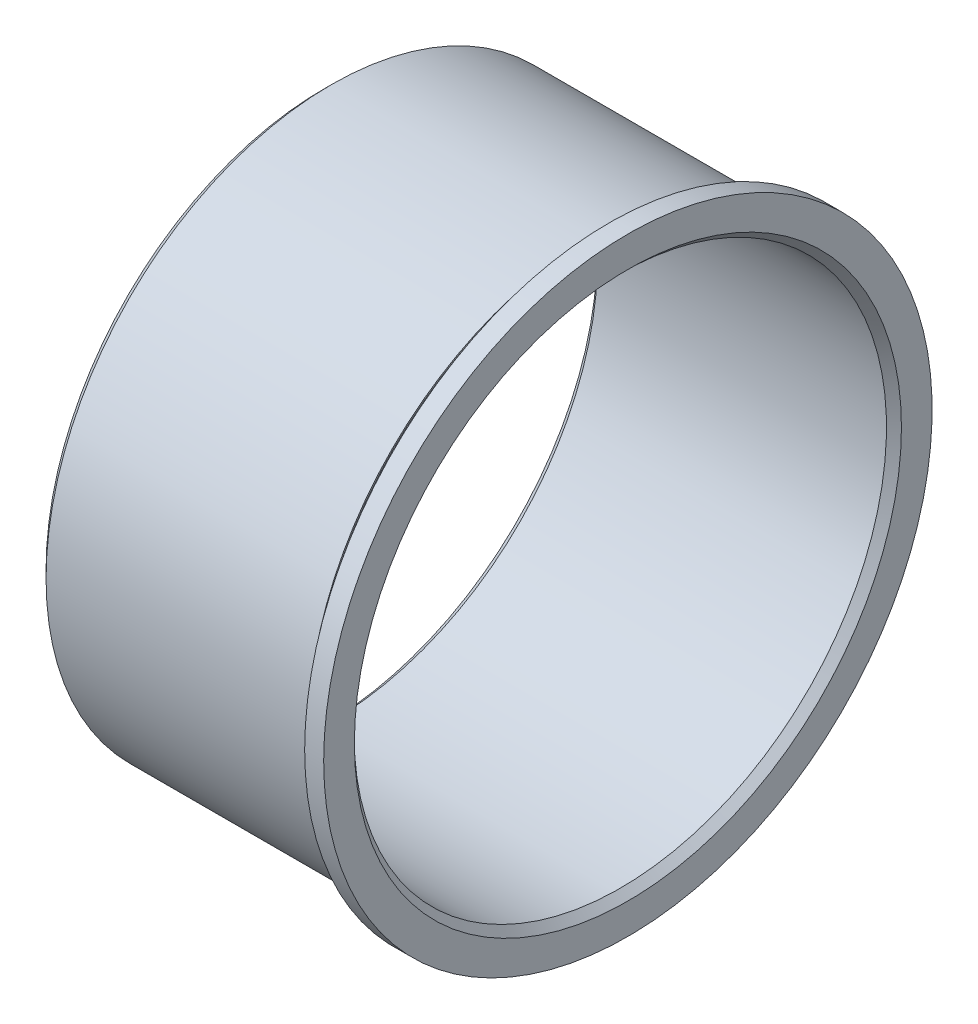
ISO-10303-21;
HEADER;
FILE_DESCRIPTION(('STEP AP214'),'2;1');
FILE_NAME('part.step','',(''),(''),'','','');
FILE_SCHEMA(('AUTOMOTIVE_DESIGN { 1 0 10303 214 1 1 1 1 }'));
ENDSEC;
DATA;
#1=APPLICATION_CONTEXT('core data for automotive mechanical design processes');
#2=APPLICATION_PROTOCOL_DEFINITION('international standard','automotive_design',2000,#1);
#3=PRODUCT_CONTEXT('',#1,'mechanical');
#4=PRODUCT('Part','Part','',(#3));
#5=PRODUCT_RELATED_PRODUCT_CATEGORY('part','',(#4));
#6=PRODUCT_DEFINITION_FORMATION('','',#4);
#7=PRODUCT_DEFINITION_CONTEXT('part definition',#1,'design');
#8=PRODUCT_DEFINITION('design','',#6,#7);
#9=PRODUCT_DEFINITION_SHAPE('','',#8);
#10=(LENGTH_UNIT() NAMED_UNIT(*) SI_UNIT(.MILLI.,.METRE.));
#11=(NAMED_UNIT(*) PLANE_ANGLE_UNIT() SI_UNIT($,.RADIAN.));
#12=(NAMED_UNIT(*) SI_UNIT($,.STERADIAN.) SOLID_ANGLE_UNIT());
#13=UNCERTAINTY_MEASURE_WITH_UNIT(LENGTH_MEASURE(1.E-05),#10,'distance_accuracy_value','');
#14=(GEOMETRIC_REPRESENTATION_CONTEXT(3) GLOBAL_UNCERTAINTY_ASSIGNED_CONTEXT((#13)) GLOBAL_UNIT_ASSIGNED_CONTEXT((#10,
#11,#12)) REPRESENTATION_CONTEXT('',''));
#15=CARTESIAN_POINT('',(0.,0.,0.));
#16=DIRECTION('',(0.,0.,1.));
#17=DIRECTION('',(1.,0.,0.));
#18=AXIS2_PLACEMENT_3D('',#15,#16,#17);
#19=CARTESIAN_POINT('',(-20.,36.5,0.));
#20=DIRECTION('',(1.,0.,0.));
#21=DIRECTION('',(0.,0.,-1.));
#22=AXIS2_PLACEMENT_3D('',#19,#20,#21);
#23=PLANE('',#22);
#24=CARTESIAN_POINT('',(-20.,0.,0.));
#25=DIRECTION('',(-1.,0.,0.));
#26=DIRECTION('',(0.,0.,1.));
#27=AXIS2_PLACEMENT_3D('',#24,#25,#26);
#28=CIRCLE('',#27,35.9656887748071);
#29=CARTESIAN_POINT('',(-20.,0.,35.9656887748071));
#30=VERTEX_POINT('',#29);
#31=EDGE_CURVE('E10',#30,#30,#28,.T.);
#32=ORIENTED_EDGE('',*,*,#31,.F.);
#33=EDGE_LOOP('',(#32));
#34=FACE_BOUND('',#33,.T.);
#35=CARTESIAN_POINT('',(-20.,0.,0.));
#36=DIRECTION('',(-1.,0.,0.));
#37=DIRECTION('',(0.,0.,1.));
#38=AXIS2_PLACEMENT_3D('',#35,#36,#37);
#39=CIRCLE('',#38,36.5);
#40=CARTESIAN_POINT('',(-20.,0.,36.5));
#41=VERTEX_POINT('',#40);
#42=EDGE_CURVE('E69',#41,#41,#39,.T.);
#43=ORIENTED_EDGE('',*,*,#42,.T.);
#44=EDGE_LOOP('',(#43));
#45=FACE_BOUND('',#44,.T.);
#46=ADVANCED_FACE('F32',(#34,#45),#23,.F.);
#47=CARTESIAN_POINT('',(-20.,0.,0.));
#48=DIRECTION('',(-1.,0.,0.));
#49=DIRECTION('',(0.,0.,1.));
#50=AXIS2_PLACEMENT_3D('',#47,#48,#49);
#51=CONICAL_SURFACE('',#50,35.9656887748071,0.767944870877504);
#52=CARTESIAN_POINT('',(-19.,0.,0.));
#53=DIRECTION('',(-1.,0.,0.));
#54=DIRECTION('',(0.,0.,1.));
#55=AXIS2_PLACEMENT_3D('',#52,#53,#54);
#56=CIRCLE('',#55,35.);
#57=CARTESIAN_POINT('',(-19.,0.,35.));
#58=VERTEX_POINT('',#57);
#59=EDGE_CURVE('E38',#58,#58,#56,.T.);
#60=ORIENTED_EDGE('',*,*,#59,.F.);
#61=EDGE_LOOP('',(#60));
#62=FACE_BOUND('',#61,.T.);
#63=ORIENTED_EDGE('',*,*,#31,.T.);
#64=EDGE_LOOP('',(#63));
#65=FACE_BOUND('',#64,.T.);
#66=ADVANCED_FACE('F124',(#62,#65),#51,.F.);
#67=CARTESIAN_POINT('',(-20.,0.,0.));
#68=DIRECTION('',(-1.,0.,0.));
#69=DIRECTION('',(0.,0.,1.));
#70=AXIS2_PLACEMENT_3D('',#67,#68,#69);
#71=CYLINDRICAL_SURFACE('',#70,35.);
#72=CARTESIAN_POINT('',(19.,0.,0.));
#73=DIRECTION('',(-1.,0.,0.));
#74=DIRECTION('',(0.,0.,1.));
#75=AXIS2_PLACEMENT_3D('',#72,#73,#74);
#76=CIRCLE('',#75,35.);
#77=CARTESIAN_POINT('',(19.,0.,35.));
#78=VERTEX_POINT('',#77);
#79=EDGE_CURVE('E42',#78,#78,#76,.T.);
#80=ORIENTED_EDGE('',*,*,#79,.F.);
#81=EDGE_LOOP('',(#80));
#82=FACE_BOUND('',#81,.T.);
#83=ORIENTED_EDGE('',*,*,#59,.T.);
#84=EDGE_LOOP('',(#83));
#85=FACE_BOUND('',#84,.T.);
#86=ADVANCED_FACE('F119',(#82,#85),#71,.F.);
#87=CARTESIAN_POINT('',(19.,0.,0.));
#88=DIRECTION('',(1.,0.,0.));
#89=DIRECTION('',(0.,0.,-1.));
#90=AXIS2_PLACEMENT_3D('',#87,#88,#89);
#91=CONICAL_SURFACE('',#90,35.,0.767944870877504);
#92=CARTESIAN_POINT('',(20.,0.,0.));
#93=DIRECTION('',(-1.,0.,0.));
#94=DIRECTION('',(0.,0.,1.));
#95=AXIS2_PLACEMENT_3D('',#92,#93,#94);
#96=CIRCLE('',#95,35.9656887748071);
#97=CARTESIAN_POINT('',(20.,0.,35.9656887748071));
#98=VERTEX_POINT('',#97);
#99=EDGE_CURVE('E46',#98,#98,#96,.T.);
#100=ORIENTED_EDGE('',*,*,#99,.F.);
#101=EDGE_LOOP('',(#100));
#102=FACE_BOUND('',#101,.T.);
#103=ORIENTED_EDGE('',*,*,#79,.T.);
#104=EDGE_LOOP('',(#103));
#105=FACE_BOUND('',#104,.T.);
#106=ADVANCED_FACE('F113',(#102,#105),#91,.F.);
#107=CARTESIAN_POINT('',(20.,35.9656887748071,0.));
#108=DIRECTION('',(-1.,0.,0.));
#109=DIRECTION('',(0.,0.,1.));
#110=AXIS2_PLACEMENT_3D('',#107,#108,#109);
#111=PLANE('',#110);
#112=CARTESIAN_POINT('',(20.,0.,0.));
#113=DIRECTION('',(-1.,0.,0.));
#114=DIRECTION('',(0.,0.,1.));
#115=AXIS2_PLACEMENT_3D('',#112,#113,#114);
#116=CIRCLE('',#115,40.);
#117=CARTESIAN_POINT('',(20.,0.,40.));
#118=VERTEX_POINT('',#117);
#119=EDGE_CURVE('E51',#118,#118,#116,.T.);
#120=ORIENTED_EDGE('',*,*,#119,.F.);
#121=EDGE_LOOP('',(#120));
#122=FACE_BOUND('',#121,.T.);
#123=ORIENTED_EDGE('',*,*,#99,.T.);
#124=EDGE_LOOP('',(#123));
#125=FACE_BOUND('',#124,.T.);
#126=ADVANCED_FACE('F107',(#122,#125),#111,.F.);
#127=CARTESIAN_POINT('',(-20.,0.,0.));
#128=DIRECTION('',(-1.,0.,0.));
#129=DIRECTION('',(0.,0.,1.));
#130=AXIS2_PLACEMENT_3D('',#127,#128,#129);
#131=CYLINDRICAL_SURFACE('',#130,40.);
#132=CARTESIAN_POINT('',(17.5,0.,0.));
#133=DIRECTION('',(-1.,0.,0.));
#134=DIRECTION('',(0.,0.,1.));
#135=AXIS2_PLACEMENT_3D('',#132,#133,#134);
#136=CIRCLE('',#135,40.);
#137=CARTESIAN_POINT('',(17.5,0.,40.));
#138=VERTEX_POINT('',#137);
#139=EDGE_CURVE('E54',#138,#138,#136,.T.);
#140=ORIENTED_EDGE('',*,*,#139,.F.);
#141=EDGE_LOOP('',(#140));
#142=FACE_BOUND('',#141,.T.);
#143=ORIENTED_EDGE('',*,*,#119,.T.);
#144=EDGE_LOOP('',(#143));
#145=FACE_BOUND('',#144,.T.);
#146=ADVANCED_FACE('F101',(#142,#145),#131,.T.);
#147=CARTESIAN_POINT('',(17.5,40.,0.));
#148=DIRECTION('',(1.,0.,0.));
#149=DIRECTION('',(0.,0.,-1.));
#150=AXIS2_PLACEMENT_3D('',#147,#148,#149);
#151=PLANE('',#150);
#152=CARTESIAN_POINT('',(17.5,0.,0.));
#153=DIRECTION('',(-1.,0.,0.));
#154=DIRECTION('',(0.,0.,1.));
#155=AXIS2_PLACEMENT_3D('',#152,#153,#154);
#156=CIRCLE('',#155,37.3);
#157=CARTESIAN_POINT('',(17.5,0.,37.3));
#158=VERTEX_POINT('',#157);
#159=EDGE_CURVE('E57',#158,#158,#156,.T.);
#160=ORIENTED_EDGE('',*,*,#159,.F.);
#161=EDGE_LOOP('',(#160));
#162=FACE_BOUND('',#161,.T.);
#163=ORIENTED_EDGE('',*,*,#139,.T.);
#164=EDGE_LOOP('',(#163));
#165=FACE_BOUND('',#164,.T.);
#166=ADVANCED_FACE('F95',(#162,#165),#151,.F.);
#167=CARTESIAN_POINT('',(-20.,0.,0.));
#168=DIRECTION('',(-1.,0.,0.));
#169=DIRECTION('',(0.,0.,1.));
#170=AXIS2_PLACEMENT_3D('',#167,#168,#169);
#171=CYLINDRICAL_SURFACE('',#170,37.3);
#172=CARTESIAN_POINT('',(15.5,0.,0.));
#173=DIRECTION('',(-1.,0.,0.));
#174=DIRECTION('',(0.,0.,1.));
#175=AXIS2_PLACEMENT_3D('',#172,#173,#174);
#176=CIRCLE('',#175,37.3);
#177=CARTESIAN_POINT('',(15.5,0.,37.3));
#178=VERTEX_POINT('',#177);
#179=EDGE_CURVE('E60',#178,#178,#176,.T.);
#180=ORIENTED_EDGE('',*,*,#179,.F.);
#181=EDGE_LOOP('',(#180));
#182=FACE_BOUND('',#181,.T.);
#183=ORIENTED_EDGE('',*,*,#159,.T.);
#184=EDGE_LOOP('',(#183));
#185=FACE_BOUND('',#184,.T.);
#186=ADVANCED_FACE('F89',(#182,#185),#171,.T.);
#187=CARTESIAN_POINT('',(15.5,37.3,0.));
#188=DIRECTION('',(-1.,0.,0.));
#189=DIRECTION('',(0.,0.,1.));
#190=AXIS2_PLACEMENT_3D('',#187,#188,#189);
#191=PLANE('',#190);
#192=CARTESIAN_POINT('',(15.5,0.,0.));
#193=DIRECTION('',(-1.,0.,0.));
#194=DIRECTION('',(0.,0.,1.));
#195=AXIS2_PLACEMENT_3D('',#192,#193,#194);
#196=CIRCLE('',#195,37.5);
#197=CARTESIAN_POINT('',(15.5,0.,37.5));
#198=VERTEX_POINT('',#197);
#199=EDGE_CURVE('E63',#198,#198,#196,.T.);
#200=ORIENTED_EDGE('',*,*,#199,.F.);
#201=EDGE_LOOP('',(#200));
#202=FACE_BOUND('',#201,.T.);
#203=ORIENTED_EDGE('',*,*,#179,.T.);
#204=EDGE_LOOP('',(#203));
#205=FACE_BOUND('',#204,.T.);
#206=ADVANCED_FACE('F83',(#202,#205),#191,.F.);
#207=CARTESIAN_POINT('',(-20.,0.,0.));
#208=DIRECTION('',(-1.,0.,0.));
#209=DIRECTION('',(0.,0.,1.));
#210=AXIS2_PLACEMENT_3D('',#207,#208,#209);
#211=CYLINDRICAL_SURFACE('',#210,37.5);
#212=CARTESIAN_POINT('',(-19.,0.,0.));
#213=DIRECTION('',(-1.,0.,0.));
#214=DIRECTION('',(0.,0.,1.));
#215=AXIS2_PLACEMENT_3D('',#212,#213,#214);
#216=CIRCLE('',#215,37.5);
#217=CARTESIAN_POINT('',(-19.,0.,37.5));
#218=VERTEX_POINT('',#217);
#219=EDGE_CURVE('E66',#218,#218,#216,.T.);
#220=ORIENTED_EDGE('',*,*,#219,.F.);
#221=EDGE_LOOP('',(#220));
#222=FACE_BOUND('',#221,.T.);
#223=ORIENTED_EDGE('',*,*,#199,.T.);
#224=EDGE_LOOP('',(#223));
#225=FACE_BOUND('',#224,.T.);
#226=ADVANCED_FACE('F77',(#222,#225),#211,.T.);
#227=CARTESIAN_POINT('',(-19.,0.,0.));
#228=DIRECTION('',(1.,0.,0.));
#229=DIRECTION('',(0.,0.,-1.));
#230=AXIS2_PLACEMENT_3D('',#227,#228,#229);
#231=CONICAL_SURFACE('',#230,37.5,0.785398163397452);
#232=ORIENTED_EDGE('',*,*,#42,.F.);
#233=EDGE_LOOP('',(#232));
#234=FACE_BOUND('',#233,.T.);
#235=ORIENTED_EDGE('',*,*,#219,.T.);
#236=EDGE_LOOP('',(#235));
#237=FACE_BOUND('',#236,.T.);
#238=ADVANCED_FACE('F74',(#234,#237),#231,.T.);
#239=CLOSED_SHELL('',(#46,#66,#86,#106,#126,#146,#166,#186,#206,#226,#238));
#240=MANIFOLD_SOLID_BREP('B2',#239);
#241=ADVANCED_BREP_SHAPE_REPRESENTATION('',(#18,#240),#14);
#242=SHAPE_DEFINITION_REPRESENTATION(#9,#241);
ENDSEC;
END-ISO-10303-21;
